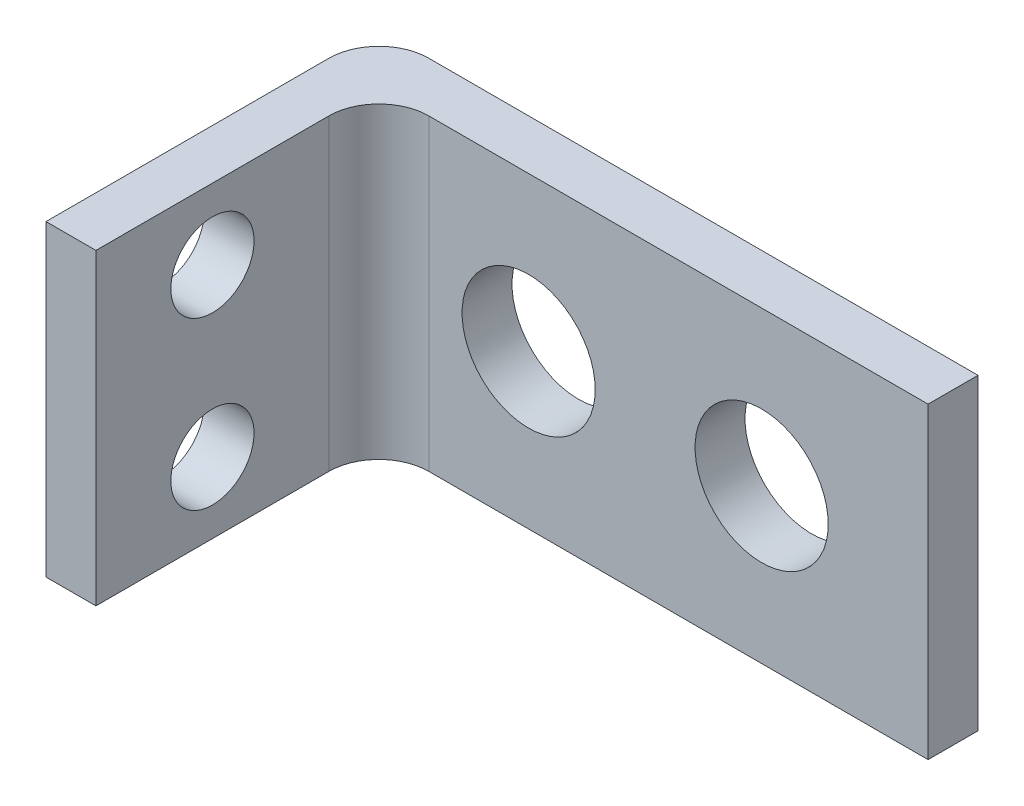
ISO-10303-21;
HEADER;
FILE_DESCRIPTION(('STEP AP214'),'2;1');
FILE_NAME('part.step','',(''),(''),'','','');
FILE_SCHEMA(('AUTOMOTIVE_DESIGN { 1 0 10303 214 1 1 1 1 }'));
ENDSEC;
DATA;
#1=APPLICATION_CONTEXT('core data for automotive mechanical design processes');
#2=APPLICATION_PROTOCOL_DEFINITION('international standard','automotive_design',2000,#1);
#3=PRODUCT_CONTEXT('',#1,'mechanical');
#4=PRODUCT('Part','Part','',(#3));
#5=PRODUCT_RELATED_PRODUCT_CATEGORY('part','',(#4));
#6=PRODUCT_DEFINITION_FORMATION('','',#4);
#7=PRODUCT_DEFINITION_CONTEXT('part definition',#1,'design');
#8=PRODUCT_DEFINITION('design','',#6,#7);
#9=PRODUCT_DEFINITION_SHAPE('','',#8);
#10=(LENGTH_UNIT() NAMED_UNIT(*) SI_UNIT(.MILLI.,.METRE.));
#11=(NAMED_UNIT(*) PLANE_ANGLE_UNIT() SI_UNIT($,.RADIAN.));
#12=(NAMED_UNIT(*) SI_UNIT($,.STERADIAN.) SOLID_ANGLE_UNIT());
#13=UNCERTAINTY_MEASURE_WITH_UNIT(LENGTH_MEASURE(1.E-05),#10,'distance_accuracy_value','');
#14=(GEOMETRIC_REPRESENTATION_CONTEXT(3) GLOBAL_UNCERTAINTY_ASSIGNED_CONTEXT((#13)) GLOBAL_UNIT_ASSIGNED_CONTEXT((#10,
#11,#12)) REPRESENTATION_CONTEXT('',''));
#15=CARTESIAN_POINT('',(0.,0.,0.));
#16=DIRECTION('',(0.,0.,1.));
#17=DIRECTION('',(1.,0.,0.));
#18=AXIS2_PLACEMENT_3D('',#15,#16,#17);
#19=CARTESIAN_POINT('',(0.,9.25,3.));
#20=DIRECTION('',(0.,1.,0.));
#21=DIRECTION('',(-1.,0.,0.));
#22=AXIS2_PLACEMENT_3D('',#19,#20,#21);
#23=PLANE('',#22);
#24=DIRECTION('',(1.,0.,0.));
#25=VECTOR('',#24,1.);
#26=CARTESIAN_POINT('',(0.,9.25,0.));
#27=LINE('',#26,#25);
#28=CARTESIAN_POINT('',(-14.,9.25,0.));
#29=VERTEX_POINT('',#28);
#30=CARTESIAN_POINT('',(19.,9.25,0.));
#31=VERTEX_POINT('',#30);
#32=EDGE_CURVE('E166',#29,#31,#27,.T.);
#33=ORIENTED_EDGE('',*,*,#32,.F.);
#34=CARTESIAN_POINT('',(-14.,9.25,3.));
#35=DIRECTION('',(0.,1.,0.));
#36=DIRECTION('',(-1.,0.,0.));
#37=AXIS2_PLACEMENT_3D('',#34,#35,#36);
#38=CIRCLE('',#37,3.);
#39=CARTESIAN_POINT('',(-17.,9.25,3.));
#40=VERTEX_POINT('',#39);
#41=EDGE_CURVE('E111',#29,#40,#38,.T.);
#42=ORIENTED_EDGE('',*,*,#41,.T.);
#43=DIRECTION('',(0.,0.,-1.));
#44=VECTOR('',#43,1.);
#45=CARTESIAN_POINT('',(-17.,9.25,3.));
#46=LINE('',#45,#44);
#47=CARTESIAN_POINT('',(-17.,9.25,20.));
#48=VERTEX_POINT('',#47);
#49=EDGE_CURVE('E104',#48,#40,#46,.T.);
#50=ORIENTED_EDGE('',*,*,#49,.F.);
#51=DIRECTION('',(1.,0.,0.));
#52=VECTOR('',#51,1.);
#53=CARTESIAN_POINT('',(0.,9.25,20.));
#54=LINE('',#53,#52);
#55=CARTESIAN_POINT('',(-14.,9.25,20.));
#56=VERTEX_POINT('',#55);
#57=EDGE_CURVE('E108',#48,#56,#54,.T.);
#58=ORIENTED_EDGE('',*,*,#57,.T.);
#59=DIRECTION('',(0.,0.,-1.));
#60=VECTOR('',#59,1.);
#61=CARTESIAN_POINT('',(-14.,9.25,20.));
#62=LINE('',#61,#60);
#63=CARTESIAN_POINT('',(-14.,9.25,6.));
#64=VERTEX_POINT('',#63);
#65=EDGE_CURVE('E140',#56,#64,#62,.T.);
#66=ORIENTED_EDGE('',*,*,#65,.T.);
#67=CARTESIAN_POINT('',(-11.,9.25,6.));
#68=DIRECTION('',(0.,1.,0.));
#69=DIRECTION('',(-1.,0.,0.));
#70=AXIS2_PLACEMENT_3D('',#67,#68,#69);
#71=CIRCLE('',#70,3.);
#72=CARTESIAN_POINT('',(-11.,9.25,3.));
#73=VERTEX_POINT('',#72);
#74=EDGE_CURVE('E50',#64,#73,#71,.F.);
#75=ORIENTED_EDGE('',*,*,#74,.T.);
#76=DIRECTION('',(1.,0.,0.));
#77=VECTOR('',#76,1.);
#78=CARTESIAN_POINT('',(0.,9.25,3.));
#79=LINE('',#78,#77);
#80=CARTESIAN_POINT('',(19.,9.25,3.));
#81=VERTEX_POINT('',#80);
#82=EDGE_CURVE('E153',#73,#81,#79,.T.);
#83=ORIENTED_EDGE('',*,*,#82,.T.);
#84=DIRECTION('',(0.,0.,-1.));
#85=VECTOR('',#84,1.);
#86=CARTESIAN_POINT('',(19.,9.25,3.));
#87=LINE('',#86,#85);
#88=EDGE_CURVE('E160',#81,#31,#87,.T.);
#89=ORIENTED_EDGE('',*,*,#88,.T.);
#90=EDGE_LOOP('',(#33,#42,#50,#58,#66,#75,#83,#89));
#91=FACE_BOUND('',#90,.T.);
#92=ADVANCED_FACE('F42',(#91),#23,.T.);
#93=CARTESIAN_POINT('',(-17.,0.,3.));
#94=DIRECTION('',(1.,0.,0.));
#95=DIRECTION('',(0.,0.,-1.));
#96=AXIS2_PLACEMENT_3D('',#93,#94,#95);
#97=PLANE('',#96);
#98=CARTESIAN_POINT('',(-17.,5.,13.));
#99=DIRECTION('',(1.,0.,0.));
#100=DIRECTION('',(0.,0.,-1.));
#101=AXIS2_PLACEMENT_3D('',#98,#99,#100);
#102=CIRCLE('',#101,2.5);
#103=CARTESIAN_POINT('',(-17.,5.,10.5));
#104=VERTEX_POINT('',#103);
#105=EDGE_CURVE('E129',#104,#104,#102,.T.);
#106=ORIENTED_EDGE('',*,*,#105,.T.);
#107=EDGE_LOOP('',(#106));
#108=FACE_BOUND('',#107,.T.);
#109=CARTESIAN_POINT('',(-17.,-5.,13.));
#110=DIRECTION('',(1.,0.,0.));
#111=DIRECTION('',(0.,0.,-1.));
#112=AXIS2_PLACEMENT_3D('',#109,#110,#111);
#113=CIRCLE('',#112,2.5);
#114=CARTESIAN_POINT('',(-17.,-5.,10.5));
#115=VERTEX_POINT('',#114);
#116=EDGE_CURVE('E382',#115,#115,#113,.T.);
#117=ORIENTED_EDGE('',*,*,#116,.T.);
#118=EDGE_LOOP('',(#117));
#119=FACE_BOUND('',#118,.T.);
#120=ORIENTED_EDGE('',*,*,#49,.T.);
#121=DIRECTION('',(0.,-1.,0.));
#122=VECTOR('',#121,1.);
#123=CARTESIAN_POINT('',(-17.,0.,3.));
#124=LINE('',#123,#122);
#125=CARTESIAN_POINT('',(-17.,-9.25,3.));
#126=VERTEX_POINT('',#125);
#127=EDGE_CURVE('E115',#40,#126,#124,.T.);
#128=ORIENTED_EDGE('',*,*,#127,.T.);
#129=DIRECTION('',(0.,0.,-1.));
#130=VECTOR('',#129,1.);
#131=CARTESIAN_POINT('',(-17.,-9.25,3.));
#132=LINE('',#131,#130);
#133=CARTESIAN_POINT('',(-17.,-9.25,20.));
#134=VERTEX_POINT('',#133);
#135=EDGE_CURVE('E116',#134,#126,#132,.T.);
#136=ORIENTED_EDGE('',*,*,#135,.F.);
#137=DIRECTION('',(0.,-1.,0.));
#138=VECTOR('',#137,1.);
#139=CARTESIAN_POINT('',(-17.,0.,20.));
#140=LINE('',#139,#138);
#141=EDGE_CURVE('E119',#48,#134,#140,.T.);
#142=ORIENTED_EDGE('',*,*,#141,.F.);
#143=EDGE_LOOP('',(#120,#128,#136,#142));
#144=FACE_BOUND('',#143,.T.);
#145=ADVANCED_FACE('F120',(#108,#119,#144),#97,.F.);
#146=CARTESIAN_POINT('',(0.,-9.25,3.));
#147=DIRECTION('',(0.,1.,0.));
#148=DIRECTION('',(0.,0.,1.));
#149=AXIS2_PLACEMENT_3D('',#146,#147,#148);
#150=PLANE('',#149);
#151=ORIENTED_EDGE('',*,*,#135,.T.);
#152=CARTESIAN_POINT('',(-14.,-9.25,3.));
#153=DIRECTION('',(0.,1.,0.));
#154=DIRECTION('',(0.,0.,1.));
#155=AXIS2_PLACEMENT_3D('',#152,#153,#154);
#156=CIRCLE('',#155,3.);
#157=CARTESIAN_POINT('',(-14.,-9.25,0.));
#158=VERTEX_POINT('',#157);
#159=EDGE_CURVE('E179',#126,#158,#156,.F.);
#160=ORIENTED_EDGE('',*,*,#159,.T.);
#161=DIRECTION('',(1.,0.,0.));
#162=VECTOR('',#161,1.);
#163=CARTESIAN_POINT('',(0.,-9.25,0.));
#164=LINE('',#163,#162);
#165=CARTESIAN_POINT('',(19.,-9.25,0.));
#166=VERTEX_POINT('',#165);
#167=EDGE_CURVE('E168',#158,#166,#164,.T.);
#168=ORIENTED_EDGE('',*,*,#167,.T.);
#169=DIRECTION('',(0.,0.,-1.));
#170=VECTOR('',#169,1.);
#171=CARTESIAN_POINT('',(19.,-9.25,3.));
#172=LINE('',#171,#170);
#173=CARTESIAN_POINT('',(19.,-9.25,3.));
#174=VERTEX_POINT('',#173);
#175=EDGE_CURVE('E174',#174,#166,#172,.T.);
#176=ORIENTED_EDGE('',*,*,#175,.F.);
#177=DIRECTION('',(1.,0.,0.));
#178=VECTOR('',#177,1.);
#179=CARTESIAN_POINT('',(0.,-9.25,3.));
#180=LINE('',#179,#178);
#181=CARTESIAN_POINT('',(-11.,-9.25,3.));
#182=VERTEX_POINT('',#181);
#183=EDGE_CURVE('E155',#182,#174,#180,.T.);
#184=ORIENTED_EDGE('',*,*,#183,.F.);
#185=CARTESIAN_POINT('',(-11.,-9.25,6.));
#186=DIRECTION('',(0.,1.,0.));
#187=DIRECTION('',(0.,0.,1.));
#188=AXIS2_PLACEMENT_3D('',#185,#186,#187);
#189=CIRCLE('',#188,3.);
#190=CARTESIAN_POINT('',(-14.,-9.25,6.));
#191=VERTEX_POINT('',#190);
#192=EDGE_CURVE('E11',#182,#191,#189,.T.);
#193=ORIENTED_EDGE('',*,*,#192,.T.);
#194=DIRECTION('',(0.,0.,-1.));
#195=VECTOR('',#194,1.);
#196=CARTESIAN_POINT('',(-14.,-9.25,20.));
#197=LINE('',#196,#195);
#198=CARTESIAN_POINT('',(-14.,-9.25,20.));
#199=VERTEX_POINT('',#198);
#200=EDGE_CURVE('E142',#199,#191,#197,.T.);
#201=ORIENTED_EDGE('',*,*,#200,.F.);
#202=DIRECTION('',(1.,0.,0.));
#203=VECTOR('',#202,1.);
#204=CARTESIAN_POINT('',(0.,-9.25,20.));
#205=LINE('',#204,#203);
#206=EDGE_CURVE('E124',#134,#199,#205,.T.);
#207=ORIENTED_EDGE('',*,*,#206,.F.);
#208=EDGE_LOOP('',(#151,#160,#168,#176,#184,#193,#201,#207));
#209=FACE_BOUND('',#208,.T.);
#210=ADVANCED_FACE('F195',(#209),#150,.F.);
#211=CARTESIAN_POINT('',(9.,0.,3.));
#212=DIRECTION('',(0.,0.,-1.));
#213=DIRECTION('',(-1.,0.,0.));
#214=AXIS2_PLACEMENT_3D('',#211,#212,#213);
#215=CYLINDRICAL_SURFACE('',#214,4.);
#216=CARTESIAN_POINT('',(9.,0.,3.));
#217=DIRECTION('',(0.,0.,1.));
#218=DIRECTION('',(1.,0.,0.));
#219=AXIS2_PLACEMENT_3D('',#216,#217,#218);
#220=CIRCLE('',#219,4.);
#221=CARTESIAN_POINT('',(13.,0.,3.));
#222=VERTEX_POINT('',#221);
#223=EDGE_CURVE('E149',#222,#222,#220,.T.);
#224=ORIENTED_EDGE('',*,*,#223,.T.);
#225=EDGE_LOOP('',(#224));
#226=FACE_BOUND('',#225,.T.);
#227=CARTESIAN_POINT('',(9.,0.,0.));
#228=DIRECTION('',(0.,0.,1.));
#229=DIRECTION('',(1.,0.,0.));
#230=AXIS2_PLACEMENT_3D('',#227,#228,#229);
#231=CIRCLE('',#230,4.);
#232=CARTESIAN_POINT('',(13.,0.,0.));
#233=VERTEX_POINT('',#232);
#234=EDGE_CURVE('E163',#233,#233,#231,.T.);
#235=ORIENTED_EDGE('',*,*,#234,.F.);
#236=EDGE_LOOP('',(#235));
#237=FACE_BOUND('',#236,.T.);
#238=ADVANCED_FACE('F223',(#226,#237),#215,.F.);
#239=CARTESIAN_POINT('',(-5.,0.,3.));
#240=DIRECTION('',(0.,0.,-1.));
#241=DIRECTION('',(-1.,0.,0.));
#242=AXIS2_PLACEMENT_3D('',#239,#240,#241);
#243=CYLINDRICAL_SURFACE('',#242,4.);
#244=CARTESIAN_POINT('',(-5.,0.,3.));
#245=DIRECTION('',(0.,0.,1.));
#246=DIRECTION('',(1.,0.,0.));
#247=AXIS2_PLACEMENT_3D('',#244,#245,#246);
#248=CIRCLE('',#247,4.);
#249=CARTESIAN_POINT('',(-0.999999999999998,0.,3.));
#250=VERTEX_POINT('',#249);
#251=EDGE_CURVE('E146',#250,#250,#248,.T.);
#252=ORIENTED_EDGE('',*,*,#251,.T.);
#253=EDGE_LOOP('',(#252));
#254=FACE_BOUND('',#253,.T.);
#255=CARTESIAN_POINT('',(-5.,0.,0.));
#256=DIRECTION('',(0.,0.,1.));
#257=DIRECTION('',(1.,0.,0.));
#258=AXIS2_PLACEMENT_3D('',#255,#256,#257);
#259=CIRCLE('',#258,4.);
#260=CARTESIAN_POINT('',(-0.999999999999998,0.,0.));
#261=VERTEX_POINT('',#260);
#262=EDGE_CURVE('E145',#261,#261,#259,.T.);
#263=ORIENTED_EDGE('',*,*,#262,.F.);
#264=EDGE_LOOP('',(#263));
#265=FACE_BOUND('',#264,.T.);
#266=ADVANCED_FACE('F225',(#254,#265),#243,.F.);
#267=CARTESIAN_POINT('',(19.,0.,3.));
#268=DIRECTION('',(1.,0.,0.));
#269=DIRECTION('',(0.,0.,-1.));
#270=AXIS2_PLACEMENT_3D('',#267,#268,#269);
#271=PLANE('',#270);
#272=DIRECTION('',(0.,-1.,0.));
#273=VECTOR('',#272,1.);
#274=CARTESIAN_POINT('',(19.,0.,0.));
#275=LINE('',#274,#273);
#276=EDGE_CURVE('E150',#31,#166,#275,.T.);
#277=ORIENTED_EDGE('',*,*,#276,.F.);
#278=ORIENTED_EDGE('',*,*,#88,.F.);
#279=DIRECTION('',(0.,-1.,0.));
#280=VECTOR('',#279,1.);
#281=CARTESIAN_POINT('',(19.,0.,3.));
#282=LINE('',#281,#280);
#283=EDGE_CURVE('E157',#81,#174,#282,.T.);
#284=ORIENTED_EDGE('',*,*,#283,.T.);
#285=ORIENTED_EDGE('',*,*,#175,.T.);
#286=EDGE_LOOP('',(#277,#278,#284,#285));
#287=FACE_BOUND('',#286,.T.);
#288=ADVANCED_FACE('F228',(#287),#271,.T.);
#289=CARTESIAN_POINT('',(0.,0.,3.));
#290=DIRECTION('',(0.,0.,1.));
#291=DIRECTION('',(1.,0.,0.));
#292=AXIS2_PLACEMENT_3D('',#289,#290,#291);
#293=PLANE('',#292);
#294=ORIENTED_EDGE('',*,*,#82,.F.);
#295=DIRECTION('',(0.,1.,0.));
#296=VECTOR('',#295,1.);
#297=CARTESIAN_POINT('',(-11.,-9.25,3.));
#298=LINE('',#297,#296);
#299=EDGE_CURVE('E186',#73,#182,#298,.F.);
#300=ORIENTED_EDGE('',*,*,#299,.T.);
#301=ORIENTED_EDGE('',*,*,#183,.T.);
#302=ORIENTED_EDGE('',*,*,#283,.F.);
#303=EDGE_LOOP('',(#294,#300,#301,#302));
#304=FACE_BOUND('',#303,.T.);
#305=ORIENTED_EDGE('',*,*,#251,.F.);
#306=EDGE_LOOP('',(#305));
#307=FACE_BOUND('',#306,.T.);
#308=ORIENTED_EDGE('',*,*,#223,.F.);
#309=EDGE_LOOP('',(#308));
#310=FACE_BOUND('',#309,.T.);
#311=ADVANCED_FACE('F189',(#304,#307,#310),#293,.T.);
#312=CARTESIAN_POINT('',(0.,0.,0.));
#313=DIRECTION('',(0.,0.,1.));
#314=DIRECTION('',(1.,0.,0.));
#315=AXIS2_PLACEMENT_3D('',#312,#313,#314);
#316=PLANE('',#315);
#317=ORIENTED_EDGE('',*,*,#262,.T.);
#318=EDGE_LOOP('',(#317));
#319=FACE_BOUND('',#318,.T.);
#320=ORIENTED_EDGE('',*,*,#234,.T.);
#321=EDGE_LOOP('',(#320));
#322=FACE_BOUND('',#321,.T.);
#323=ORIENTED_EDGE('',*,*,#167,.F.);
#324=DIRECTION('',(0.,-1.,0.));
#325=VECTOR('',#324,1.);
#326=CARTESIAN_POINT('',(-14.,0.,0.));
#327=LINE('',#326,#325);
#328=EDGE_CURVE('E181',#158,#29,#327,.F.);
#329=ORIENTED_EDGE('',*,*,#328,.T.);
#330=ORIENTED_EDGE('',*,*,#32,.T.);
#331=ORIENTED_EDGE('',*,*,#276,.T.);
#332=EDGE_LOOP('',(#323,#329,#330,#331));
#333=FACE_BOUND('',#332,.T.);
#334=ADVANCED_FACE('F203',(#319,#322,#333),#316,.F.);
#335=CARTESIAN_POINT('',(-14.,0.,20.));
#336=DIRECTION('',(1.,0.,0.));
#337=DIRECTION('',(0.,0.,-1.));
#338=AXIS2_PLACEMENT_3D('',#335,#336,#337);
#339=PLANE('',#338);
#340=CARTESIAN_POINT('',(-14.,5.,13.));
#341=DIRECTION('',(1.,0.,0.));
#342=DIRECTION('',(0.,0.,-1.));
#343=AXIS2_PLACEMENT_3D('',#340,#341,#342);
#344=CIRCLE('',#343,2.5);
#345=CARTESIAN_POINT('',(-14.,5.,10.5));
#346=VERTEX_POINT('',#345);
#347=EDGE_CURVE('E132',#346,#346,#344,.T.);
#348=ORIENTED_EDGE('',*,*,#347,.F.);
#349=EDGE_LOOP('',(#348));
#350=FACE_BOUND('',#349,.T.);
#351=CARTESIAN_POINT('',(-14.,-5.,13.));
#352=DIRECTION('',(1.,0.,0.));
#353=DIRECTION('',(0.,0.,-1.));
#354=AXIS2_PLACEMENT_3D('',#351,#352,#353);
#355=CIRCLE('',#354,2.5);
#356=CARTESIAN_POINT('',(-14.,-5.,10.5));
#357=VERTEX_POINT('',#356);
#358=EDGE_CURVE('E135',#357,#357,#355,.T.);
#359=ORIENTED_EDGE('',*,*,#358,.F.);
#360=EDGE_LOOP('',(#359));
#361=FACE_BOUND('',#360,.T.);
#362=ORIENTED_EDGE('',*,*,#200,.T.);
#363=DIRECTION('',(0.,1.,0.));
#364=VECTOR('',#363,1.);
#365=CARTESIAN_POINT('',(-14.,9.25,6.));
#366=LINE('',#365,#364);
#367=EDGE_CURVE('E184',#191,#64,#366,.T.);
#368=ORIENTED_EDGE('',*,*,#367,.T.);
#369=ORIENTED_EDGE('',*,*,#65,.F.);
#370=DIRECTION('',(0.,-1.,0.));
#371=VECTOR('',#370,1.);
#372=CARTESIAN_POINT('',(-14.,0.,20.));
#373=LINE('',#372,#371);
#374=EDGE_CURVE('E128',#56,#199,#373,.T.);
#375=ORIENTED_EDGE('',*,*,#374,.T.);
#376=EDGE_LOOP('',(#362,#368,#369,#375));
#377=FACE_BOUND('',#376,.T.);
#378=ADVANCED_FACE('F198',(#350,#361,#377),#339,.T.);
#379=CARTESIAN_POINT('',(0.,0.,20.));
#380=DIRECTION('',(0.,0.,1.));
#381=DIRECTION('',(1.,0.,0.));
#382=AXIS2_PLACEMENT_3D('',#379,#380,#381);
#383=PLANE('',#382);
#384=ORIENTED_EDGE('',*,*,#57,.F.);
#385=ORIENTED_EDGE('',*,*,#141,.T.);
#386=ORIENTED_EDGE('',*,*,#206,.T.);
#387=ORIENTED_EDGE('',*,*,#374,.F.);
#388=EDGE_LOOP('',(#384,#385,#386,#387));
#389=FACE_BOUND('',#388,.T.);
#390=ADVANCED_FACE('F126',(#389),#383,.T.);
#391=CARTESIAN_POINT('',(-14.,0.,3.));
#392=DIRECTION('',(0.,-1.,0.));
#393=DIRECTION('',(0.,0.,-1.));
#394=AXIS2_PLACEMENT_3D('',#391,#392,#393);
#395=CYLINDRICAL_SURFACE('',#394,3.);
#396=ORIENTED_EDGE('',*,*,#41,.F.);
#397=ORIENTED_EDGE('',*,*,#328,.F.);
#398=ORIENTED_EDGE('',*,*,#159,.F.);
#399=ORIENTED_EDGE('',*,*,#127,.F.);
#400=EDGE_LOOP('',(#396,#397,#398,#399));
#401=FACE_BOUND('',#400,.T.);
#402=ADVANCED_FACE('F205',(#401),#395,.T.);
#403=CARTESIAN_POINT('',(-11.,0.,6.));
#404=DIRECTION('',(0.,-1.,0.));
#405=DIRECTION('',(0.,0.,-1.));
#406=AXIS2_PLACEMENT_3D('',#403,#404,#405);
#407=CYLINDRICAL_SURFACE('',#406,3.);
#408=ORIENTED_EDGE('',*,*,#192,.F.);
#409=ORIENTED_EDGE('',*,*,#299,.F.);
#410=ORIENTED_EDGE('',*,*,#74,.F.);
#411=ORIENTED_EDGE('',*,*,#367,.F.);
#412=EDGE_LOOP('',(#408,#409,#410,#411));
#413=FACE_BOUND('',#412,.T.);
#414=ADVANCED_FACE('F44',(#413),#407,.F.);
#415=CARTESIAN_POINT('',(-17.,-5.,13.));
#416=DIRECTION('',(1.,0.,0.));
#417=DIRECTION('',(0.,0.,-1.));
#418=AXIS2_PLACEMENT_3D('',#415,#416,#417);
#419=CYLINDRICAL_SURFACE('',#418,2.5);
#420=ORIENTED_EDGE('',*,*,#116,.F.);
#421=EDGE_LOOP('',(#420));
#422=FACE_BOUND('',#421,.T.);
#423=ORIENTED_EDGE('',*,*,#358,.T.);
#424=EDGE_LOOP('',(#423));
#425=FACE_BOUND('',#424,.T.);
#426=ADVANCED_FACE('F211',(#422,#425),#419,.F.);
#427=CARTESIAN_POINT('',(-17.,5.,13.));
#428=DIRECTION('',(1.,0.,0.));
#429=DIRECTION('',(0.,0.,-1.));
#430=AXIS2_PLACEMENT_3D('',#427,#428,#429);
#431=CYLINDRICAL_SURFACE('',#430,2.5);
#432=ORIENTED_EDGE('',*,*,#105,.F.);
#433=EDGE_LOOP('',(#432));
#434=FACE_BOUND('',#433,.T.);
#435=ORIENTED_EDGE('',*,*,#347,.T.);
#436=EDGE_LOOP('',(#435));
#437=FACE_BOUND('',#436,.T.);
#438=ADVANCED_FACE('F328',(#434,#437),#431,.F.);
#439=CLOSED_SHELL('',(#92,#145,#210,#238,#266,#288,#311,#334,#378,#390,#402,#414,#426,#438));
#440=MANIFOLD_SOLID_BREP('B2',#439);
#441=ADVANCED_BREP_SHAPE_REPRESENTATION('',(#18,#440),#14);
#442=SHAPE_DEFINITION_REPRESENTATION(#9,#441);
ENDSEC;
END-ISO-10303-21;
